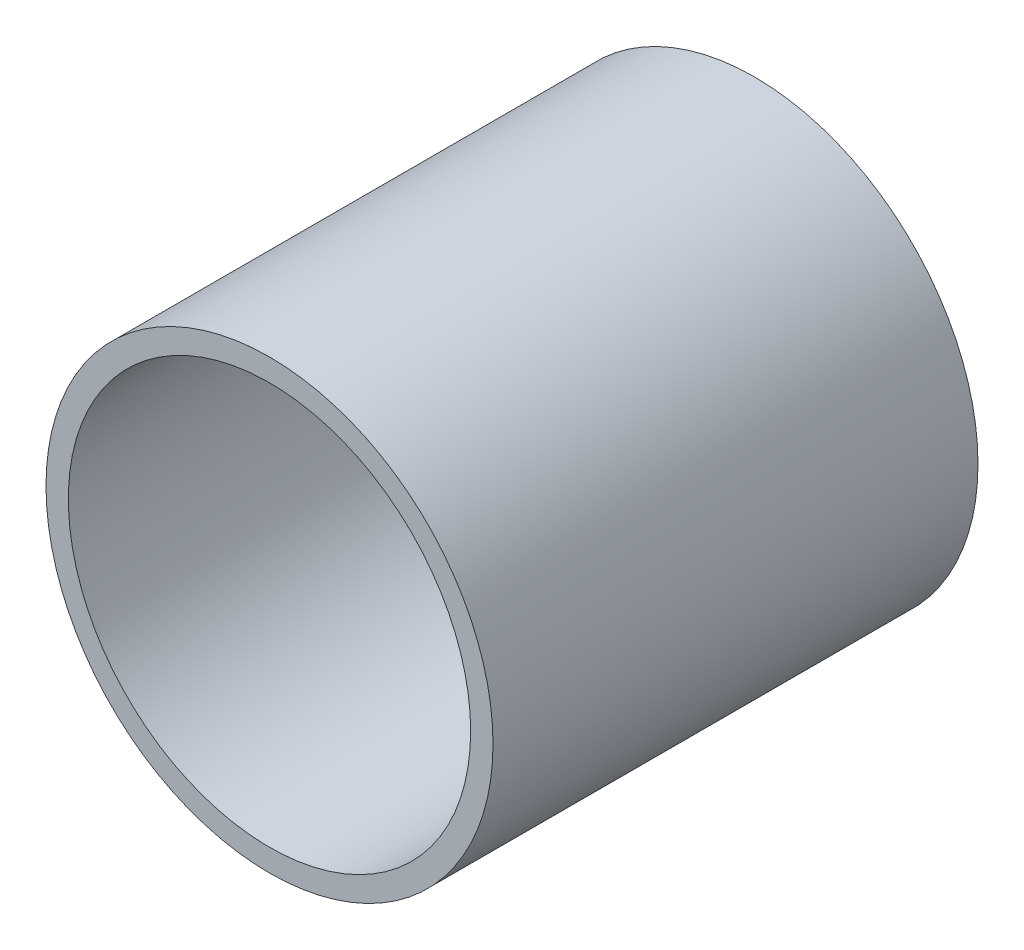
ISO-10303-21;
HEADER;
FILE_DESCRIPTION(('STEP AP214'),'2;1');
FILE_NAME('part.step','',(''),(''),'','','');
FILE_SCHEMA(('AUTOMOTIVE_DESIGN { 1 0 10303 214 1 1 1 1 }'));
ENDSEC;
DATA;
#1=APPLICATION_CONTEXT('core data for automotive mechanical design processes');
#2=APPLICATION_PROTOCOL_DEFINITION('international standard','automotive_design',2000,#1);
#3=PRODUCT_CONTEXT('',#1,'mechanical');
#4=PRODUCT('Part','Part','',(#3));
#5=PRODUCT_RELATED_PRODUCT_CATEGORY('part','',(#4));
#6=PRODUCT_DEFINITION_FORMATION('','',#4);
#7=PRODUCT_DEFINITION_CONTEXT('part definition',#1,'design');
#8=PRODUCT_DEFINITION('design','',#6,#7);
#9=PRODUCT_DEFINITION_SHAPE('','',#8);
#10=(LENGTH_UNIT() NAMED_UNIT(*) SI_UNIT(.MILLI.,.METRE.));
#11=(NAMED_UNIT(*) PLANE_ANGLE_UNIT() SI_UNIT($,.RADIAN.));
#12=(NAMED_UNIT(*) SI_UNIT($,.STERADIAN.) SOLID_ANGLE_UNIT());
#13=UNCERTAINTY_MEASURE_WITH_UNIT(LENGTH_MEASURE(1.E-05),#10,'distance_accuracy_value','');
#14=(GEOMETRIC_REPRESENTATION_CONTEXT(3) GLOBAL_UNCERTAINTY_ASSIGNED_CONTEXT((#13)) GLOBAL_UNIT_ASSIGNED_CONTEXT((#10,
#11,#12)) REPRESENTATION_CONTEXT('',''));
#15=CARTESIAN_POINT('',(0.,0.,0.));
#16=DIRECTION('',(0.,0.,1.));
#17=DIRECTION('',(1.,0.,0.));
#18=AXIS2_PLACEMENT_3D('',#15,#16,#17);
#19=CARTESIAN_POINT('',(0.,0.,217.));
#20=DIRECTION('',(0.,0.,1.));
#21=DIRECTION('',(1.,0.,0.));
#22=AXIS2_PLACEMENT_3D('',#19,#20,#21);
#23=PLANE('',#22);
#24=CARTESIAN_POINT('',(0.,0.,217.));
#25=DIRECTION('',(0.,0.,1.));
#26=DIRECTION('',(1.,0.,0.));
#27=AXIS2_PLACEMENT_3D('',#24,#25,#26);
#28=CIRCLE('',#27,100.);
#29=CARTESIAN_POINT('',(100.,0.,217.));
#30=VERTEX_POINT('',#29);
#31=EDGE_CURVE('E10',#30,#30,#28,.T.);
#32=ORIENTED_EDGE('',*,*,#31,.T.);
#33=EDGE_LOOP('',(#32));
#34=FACE_BOUND('',#33,.T.);
#35=CARTESIAN_POINT('',(0.,0.,217.));
#36=DIRECTION('',(0.,0.,1.));
#37=DIRECTION('',(1.,0.,0.));
#38=AXIS2_PLACEMENT_3D('',#35,#36,#37);
#39=CIRCLE('',#38,90.);
#40=CARTESIAN_POINT('',(90.,0.,217.));
#41=VERTEX_POINT('',#40);
#42=EDGE_CURVE('E48',#41,#41,#39,.T.);
#43=ORIENTED_EDGE('',*,*,#42,.F.);
#44=EDGE_LOOP('',(#43));
#45=FACE_BOUND('',#44,.T.);
#46=ADVANCED_FACE('F37',(#34,#45),#23,.T.);
#47=CARTESIAN_POINT('',(0.,0.,0.));
#48=DIRECTION('',(0.,0.,1.));
#49=DIRECTION('',(1.,0.,0.));
#50=AXIS2_PLACEMENT_3D('',#47,#48,#49);
#51=PLANE('',#50);
#52=CARTESIAN_POINT('',(0.,0.,0.));
#53=DIRECTION('',(0.,0.,1.));
#54=DIRECTION('',(1.,0.,0.));
#55=AXIS2_PLACEMENT_3D('',#52,#53,#54);
#56=CIRCLE('',#55,100.);
#57=CARTESIAN_POINT('',(100.,0.,0.));
#58=VERTEX_POINT('',#57);
#59=EDGE_CURVE('E41',#58,#58,#56,.T.);
#60=ORIENTED_EDGE('',*,*,#59,.F.);
#61=EDGE_LOOP('',(#60));
#62=FACE_BOUND('',#61,.T.);
#63=CARTESIAN_POINT('',(0.,0.,0.));
#64=DIRECTION('',(0.,0.,1.));
#65=DIRECTION('',(1.,0.,0.));
#66=AXIS2_PLACEMENT_3D('',#63,#64,#65);
#67=CIRCLE('',#66,90.);
#68=CARTESIAN_POINT('',(90.,0.,0.));
#69=VERTEX_POINT('',#68);
#70=EDGE_CURVE('E50',#69,#69,#67,.T.);
#71=ORIENTED_EDGE('',*,*,#70,.T.);
#72=EDGE_LOOP('',(#71));
#73=FACE_BOUND('',#72,.T.);
#74=ADVANCED_FACE('F60',(#62,#73),#51,.F.);
#75=CARTESIAN_POINT('',(0.,0.,217.));
#76=DIRECTION('',(0.,0.,-1.));
#77=DIRECTION('',(-1.,0.,0.));
#78=AXIS2_PLACEMENT_3D('',#75,#76,#77);
#79=CYLINDRICAL_SURFACE('',#78,100.);
#80=ORIENTED_EDGE('',*,*,#31,.F.);
#81=EDGE_LOOP('',(#80));
#82=FACE_BOUND('',#81,.T.);
#83=ORIENTED_EDGE('',*,*,#59,.T.);
#84=EDGE_LOOP('',(#83));
#85=FACE_BOUND('',#84,.T.);
#86=ADVANCED_FACE('F39',(#82,#85),#79,.T.);
#87=CARTESIAN_POINT('',(0.,0.,217.));
#88=DIRECTION('',(0.,0.,-1.));
#89=DIRECTION('',(-1.,0.,0.));
#90=AXIS2_PLACEMENT_3D('',#87,#88,#89);
#91=CYLINDRICAL_SURFACE('',#90,90.);
#92=ORIENTED_EDGE('',*,*,#42,.T.);
#93=EDGE_LOOP('',(#92));
#94=FACE_BOUND('',#93,.T.);
#95=ORIENTED_EDGE('',*,*,#70,.F.);
#96=EDGE_LOOP('',(#95));
#97=FACE_BOUND('',#96,.T.);
#98=ADVANCED_FACE('F56',(#94,#97),#91,.F.);
#99=CLOSED_SHELL('',(#46,#74,#86,#98));
#100=MANIFOLD_SOLID_BREP('B2',#99);
#101=ADVANCED_BREP_SHAPE_REPRESENTATION('',(#18,#100),#14);
#102=SHAPE_DEFINITION_REPRESENTATION(#9,#101);
ENDSEC;
END-ISO-10303-21;
